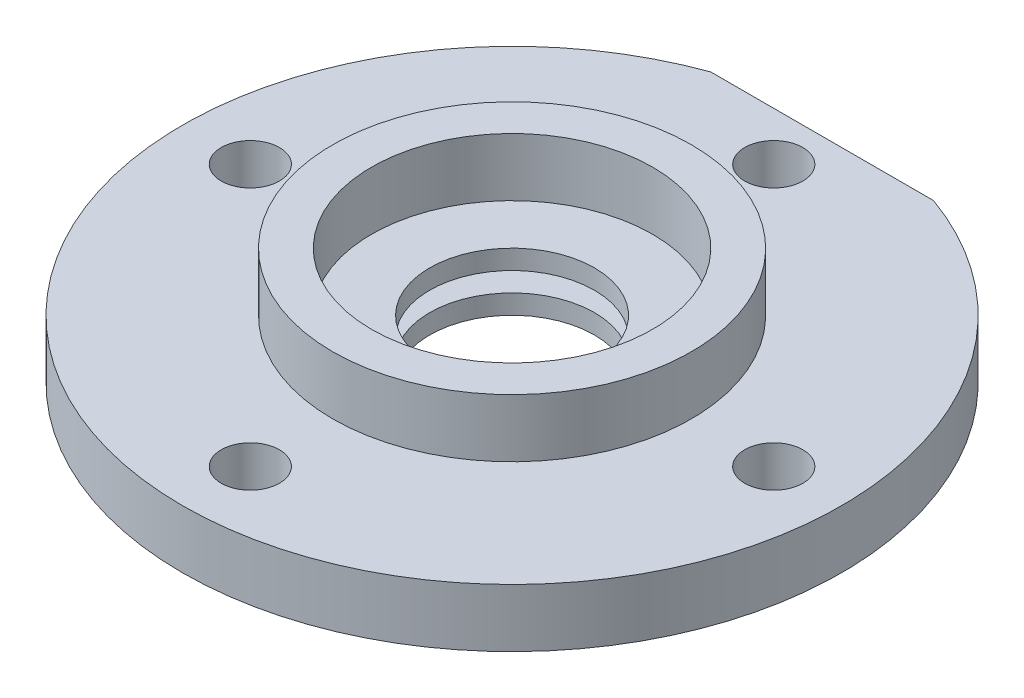
ISO-10303-21;
HEADER;
FILE_DESCRIPTION(('STEP AP214'),'2;1');
FILE_NAME('part.step','',(''),(''),'','','');
FILE_SCHEMA(('AUTOMOTIVE_DESIGN { 1 0 10303 214 1 1 1 1 }'));
ENDSEC;
DATA;
#1=APPLICATION_CONTEXT('core data for automotive mechanical design processes');
#2=APPLICATION_PROTOCOL_DEFINITION('international standard','automotive_design',2000,#1);
#3=PRODUCT_CONTEXT('',#1,'mechanical');
#4=PRODUCT('Part','Part','',(#3));
#5=PRODUCT_RELATED_PRODUCT_CATEGORY('part','',(#4));
#6=PRODUCT_DEFINITION_FORMATION('','',#4);
#7=PRODUCT_DEFINITION_CONTEXT('part definition',#1,'design');
#8=PRODUCT_DEFINITION('design','',#6,#7);
#9=PRODUCT_DEFINITION_SHAPE('','',#8);
#10=(LENGTH_UNIT() NAMED_UNIT(*) SI_UNIT(.MILLI.,.METRE.));
#11=(NAMED_UNIT(*) PLANE_ANGLE_UNIT() SI_UNIT($,.RADIAN.));
#12=(NAMED_UNIT(*) SI_UNIT($,.STERADIAN.) SOLID_ANGLE_UNIT());
#13=UNCERTAINTY_MEASURE_WITH_UNIT(LENGTH_MEASURE(1.E-05),#10,'distance_accuracy_value','');
#14=(GEOMETRIC_REPRESENTATION_CONTEXT(3) GLOBAL_UNCERTAINTY_ASSIGNED_CONTEXT((#13)) GLOBAL_UNIT_ASSIGNED_CONTEXT((#10,
#11,#12)) REPRESENTATION_CONTEXT('',''));
#15=CARTESIAN_POINT('',(0.,0.,0.));
#16=DIRECTION('',(0.,0.,1.));
#17=DIRECTION('',(1.,0.,0.));
#18=AXIS2_PLACEMENT_3D('',#15,#16,#17);
#19=CARTESIAN_POINT('',(0.,6.,0.));
#20=DIRECTION('',(0.,1.,0.));
#21=DIRECTION('',(0.,0.,1.));
#22=AXIS2_PLACEMENT_3D('',#19,#20,#21);
#23=PLANE('',#22);
#24=CARTESIAN_POINT('',(0.,6.,0.));
#25=DIRECTION('',(0.,1.,0.));
#26=DIRECTION('',(0.,0.,1.));
#27=AXIS2_PLACEMENT_3D('',#24,#25,#26);
#28=CIRCLE('',#27,18.5);
#29=CARTESIAN_POINT('',(0.,6.,18.5));
#30=VERTEX_POINT('',#29);
#31=EDGE_CURVE('E11',#30,#30,#28,.T.);
#32=ORIENTED_EDGE('',*,*,#31,.F.);
#33=EDGE_LOOP('',(#32));
#34=FACE_BOUND('',#33,.T.);
#35=CARTESIAN_POINT('',(-1.88217497143484E-13,6.,27.));
#36=DIRECTION('',(0.,1.,0.));
#37=DIRECTION('',(0.,0.,1.));
#38=AXIS2_PLACEMENT_3D('',#35,#36,#37);
#39=CIRCLE('',#38,3.);
#40=CARTESIAN_POINT('',(-1.88217497143484E-13,6.,30.));
#41=VERTEX_POINT('',#40);
#42=EDGE_CURVE('E105',#41,#41,#39,.T.);
#43=ORIENTED_EDGE('',*,*,#42,.F.);
#44=EDGE_LOOP('',(#43));
#45=FACE_BOUND('',#44,.T.);
#46=CARTESIAN_POINT('',(0.,6.,-27.));
#47=DIRECTION('',(0.,1.,0.));
#48=DIRECTION('',(0.,0.,1.));
#49=AXIS2_PLACEMENT_3D('',#46,#47,#48);
#50=CIRCLE('',#49,3.);
#51=CARTESIAN_POINT('',(0.,6.,-24.));
#52=VERTEX_POINT('',#51);
#53=EDGE_CURVE('E86',#52,#52,#50,.T.);
#54=ORIENTED_EDGE('',*,*,#53,.F.);
#55=EDGE_LOOP('',(#54));
#56=FACE_BOUND('',#55,.T.);
#57=CARTESIAN_POINT('',(0.,6.,0.));
#58=DIRECTION('',(0.,1.,0.));
#59=DIRECTION('',(0.,0.,1.));
#60=AXIS2_PLACEMENT_3D('',#57,#58,#59);
#61=CIRCLE('',#60,34.);
#62=CARTESIAN_POINT('',(-11.4891252930761,6.,-32.));
#63=VERTEX_POINT('',#62);
#64=CARTESIAN_POINT('',(11.4891252930761,6.,-32.));
#65=VERTEX_POINT('',#64);
#66=EDGE_CURVE('E78',#63,#65,#61,.T.);
#67=ORIENTED_EDGE('',*,*,#66,.T.);
#68=DIRECTION('',(-1.,0.,0.));
#69=VECTOR('',#68,1.);
#70=CARTESIAN_POINT('',(-11.4891252930761,6.,-32.));
#71=LINE('',#70,#69);
#72=EDGE_CURVE('E60',#65,#63,#71,.T.);
#73=ORIENTED_EDGE('',*,*,#72,.T.);
#74=EDGE_LOOP('',(#67,#73));
#75=FACE_BOUND('',#74,.T.);
#76=CARTESIAN_POINT('',(27.,6.,0.));
#77=DIRECTION('',(0.,1.,0.));
#78=DIRECTION('',(0.,0.,1.));
#79=AXIS2_PLACEMENT_3D('',#76,#77,#78);
#80=CIRCLE('',#79,3.);
#81=CARTESIAN_POINT('',(27.,6.,3.00000000000009));
#82=VERTEX_POINT('',#81);
#83=EDGE_CURVE('E99',#82,#82,#80,.T.);
#84=ORIENTED_EDGE('',*,*,#83,.F.);
#85=EDGE_LOOP('',(#84));
#86=FACE_BOUND('',#85,.T.);
#87=CARTESIAN_POINT('',(-27.,6.,-2.8275992658422E-13));
#88=DIRECTION('',(0.,1.,0.));
#89=DIRECTION('',(0.,0.,1.));
#90=AXIS2_PLACEMENT_3D('',#87,#88,#89);
#91=CIRCLE('',#90,3.);
#92=CARTESIAN_POINT('',(-27.,6.,2.99999999999972));
#93=VERTEX_POINT('',#92);
#94=EDGE_CURVE('E113',#93,#93,#91,.T.);
#95=ORIENTED_EDGE('',*,*,#94,.F.);
#96=EDGE_LOOP('',(#95));
#97=FACE_BOUND('',#96,.T.);
#98=ADVANCED_FACE('F42',(#34,#45,#56,#75,#86,#97),#23,.T.);
#99=CARTESIAN_POINT('',(0.,0.,0.));
#100=DIRECTION('',(0.,1.,0.));
#101=DIRECTION('',(0.,0.,1.));
#102=AXIS2_PLACEMENT_3D('',#99,#100,#101);
#103=PLANE('',#102);
#104=CARTESIAN_POINT('',(0.,0.,0.));
#105=DIRECTION('',(0.,-1.,0.));
#106=DIRECTION('',(0.,0.,-1.));
#107=AXIS2_PLACEMENT_3D('',#104,#105,#106);
#108=CIRCLE('',#107,8.5);
#109=CARTESIAN_POINT('',(0.,0.,-8.5));
#110=VERTEX_POINT('',#109);
#111=EDGE_CURVE('E156',#110,#110,#108,.T.);
#112=ORIENTED_EDGE('',*,*,#111,.F.);
#113=EDGE_LOOP('',(#112));
#114=FACE_BOUND('',#113,.T.);
#115=CARTESIAN_POINT('',(0.,0.,0.));
#116=DIRECTION('',(0.,1.,0.));
#117=DIRECTION('',(0.,0.,1.));
#118=AXIS2_PLACEMENT_3D('',#115,#116,#117);
#119=CIRCLE('',#118,34.);
#120=CARTESIAN_POINT('',(-11.4891252930761,0.,-32.));
#121=VERTEX_POINT('',#120);
#122=CARTESIAN_POINT('',(11.4891252930761,0.,-32.));
#123=VERTEX_POINT('',#122);
#124=EDGE_CURVE('E79',#121,#123,#119,.T.);
#125=ORIENTED_EDGE('',*,*,#124,.F.);
#126=DIRECTION('',(-1.,0.,0.));
#127=VECTOR('',#126,1.);
#128=CARTESIAN_POINT('',(-11.4891252930761,0.,-32.));
#129=LINE('',#128,#127);
#130=EDGE_CURVE('E68',#123,#121,#129,.T.);
#131=ORIENTED_EDGE('',*,*,#130,.F.);
#132=EDGE_LOOP('',(#125,#131));
#133=FACE_BOUND('',#132,.T.);
#134=CARTESIAN_POINT('',(0.,0.,-27.));
#135=DIRECTION('',(0.,1.,0.));
#136=DIRECTION('',(0.,0.,1.));
#137=AXIS2_PLACEMENT_3D('',#134,#135,#136);
#138=CIRCLE('',#137,3.);
#139=CARTESIAN_POINT('',(0.,0.,-24.));
#140=VERTEX_POINT('',#139);
#141=EDGE_CURVE('E90',#140,#140,#138,.T.);
#142=ORIENTED_EDGE('',*,*,#141,.T.);
#143=EDGE_LOOP('',(#142));
#144=FACE_BOUND('',#143,.T.);
#145=CARTESIAN_POINT('',(27.,0.,0.));
#146=DIRECTION('',(0.,1.,0.));
#147=DIRECTION('',(0.,0.,1.));
#148=AXIS2_PLACEMENT_3D('',#145,#146,#147);
#149=CIRCLE('',#148,3.);
#150=CARTESIAN_POINT('',(27.,0.,3.00000000000009));
#151=VERTEX_POINT('',#150);
#152=EDGE_CURVE('E101',#151,#151,#149,.T.);
#153=ORIENTED_EDGE('',*,*,#152,.T.);
#154=EDGE_LOOP('',(#153));
#155=FACE_BOUND('',#154,.T.);
#156=CARTESIAN_POINT('',(-1.88217497143484E-13,0.,27.));
#157=DIRECTION('',(0.,1.,0.));
#158=DIRECTION('',(0.,0.,1.));
#159=AXIS2_PLACEMENT_3D('',#156,#157,#158);
#160=CIRCLE('',#159,3.);
#161=CARTESIAN_POINT('',(-1.88217497143484E-13,0.,30.));
#162=VERTEX_POINT('',#161);
#163=EDGE_CURVE('E109',#162,#162,#160,.T.);
#164=ORIENTED_EDGE('',*,*,#163,.T.);
#165=EDGE_LOOP('',(#164));
#166=FACE_BOUND('',#165,.T.);
#167=CARTESIAN_POINT('',(-27.,0.,-2.8275992658422E-13));
#168=DIRECTION('',(0.,1.,0.));
#169=DIRECTION('',(0.,0.,1.));
#170=AXIS2_PLACEMENT_3D('',#167,#168,#169);
#171=CIRCLE('',#170,3.);
#172=CARTESIAN_POINT('',(-27.,0.,2.99999999999972));
#173=VERTEX_POINT('',#172);
#174=EDGE_CURVE('E117',#173,#173,#171,.T.);
#175=ORIENTED_EDGE('',*,*,#174,.T.);
#176=EDGE_LOOP('',(#175));
#177=FACE_BOUND('',#176,.T.);
#178=ADVANCED_FACE('F83',(#114,#133,#144,#155,#166,#177),#103,.F.);
#179=CARTESIAN_POINT('',(0.,6.,0.));
#180=DIRECTION('',(0.,-1.,0.));
#181=DIRECTION('',(0.,0.,-1.));
#182=AXIS2_PLACEMENT_3D('',#179,#180,#181);
#183=CYLINDRICAL_SURFACE('',#182,34.);
#184=ORIENTED_EDGE('',*,*,#124,.T.);
#185=DIRECTION('',(0.,-1.,0.));
#186=VECTOR('',#185,1.);
#187=CARTESIAN_POINT('',(11.4891252930761,6.,-32.));
#188=LINE('',#187,#186);
#189=EDGE_CURVE('E46',#65,#123,#188,.T.);
#190=ORIENTED_EDGE('',*,*,#189,.F.);
#191=ORIENTED_EDGE('',*,*,#66,.F.);
#192=DIRECTION('',(0.,-1.,0.));
#193=VECTOR('',#192,1.);
#194=CARTESIAN_POINT('',(-11.4891252930761,6.,-32.));
#195=LINE('',#194,#193);
#196=EDGE_CURVE('E73',#63,#121,#195,.T.);
#197=ORIENTED_EDGE('',*,*,#196,.T.);
#198=EDGE_LOOP('',(#184,#190,#191,#197));
#199=FACE_BOUND('',#198,.T.);
#200=ADVANCED_FACE('F44',(#199),#183,.T.);
#201=CARTESIAN_POINT('',(-11.4891252930761,6.,-32.));
#202=DIRECTION('',(0.,0.,1.));
#203=DIRECTION('',(1.,0.,0.));
#204=AXIS2_PLACEMENT_3D('',#201,#202,#203);
#205=PLANE('',#204);
#206=ORIENTED_EDGE('',*,*,#130,.T.);
#207=ORIENTED_EDGE('',*,*,#196,.F.);
#208=ORIENTED_EDGE('',*,*,#72,.F.);
#209=ORIENTED_EDGE('',*,*,#189,.T.);
#210=EDGE_LOOP('',(#206,#207,#208,#209));
#211=FACE_BOUND('',#210,.T.);
#212=ADVANCED_FACE('F72',(#211),#205,.F.);
#213=CARTESIAN_POINT('',(0.,6.,-27.));
#214=DIRECTION('',(0.,-1.,0.));
#215=DIRECTION('',(0.,0.,-1.));
#216=AXIS2_PLACEMENT_3D('',#213,#214,#215);
#217=CYLINDRICAL_SURFACE('',#216,3.);
#218=ORIENTED_EDGE('',*,*,#53,.T.);
#219=EDGE_LOOP('',(#218));
#220=FACE_BOUND('',#219,.T.);
#221=ORIENTED_EDGE('',*,*,#141,.F.);
#222=EDGE_LOOP('',(#221));
#223=FACE_BOUND('',#222,.T.);
#224=ADVANCED_FACE('F175',(#220,#223),#217,.F.);
#225=CARTESIAN_POINT('',(27.,6.,0.));
#226=DIRECTION('',(0.,-1.,0.));
#227=DIRECTION('',(0.,0.,-1.));
#228=AXIS2_PLACEMENT_3D('',#225,#226,#227);
#229=CYLINDRICAL_SURFACE('',#228,3.);
#230=ORIENTED_EDGE('',*,*,#83,.T.);
#231=EDGE_LOOP('',(#230));
#232=FACE_BOUND('',#231,.T.);
#233=ORIENTED_EDGE('',*,*,#152,.F.);
#234=EDGE_LOOP('',(#233));
#235=FACE_BOUND('',#234,.T.);
#236=ADVANCED_FACE('F179',(#232,#235),#229,.F.);
#237=CARTESIAN_POINT('',(-1.88217497143484E-13,6.,27.));
#238=DIRECTION('',(0.,-1.,0.));
#239=DIRECTION('',(0.,0.,-1.));
#240=AXIS2_PLACEMENT_3D('',#237,#238,#239);
#241=CYLINDRICAL_SURFACE('',#240,3.);
#242=ORIENTED_EDGE('',*,*,#42,.T.);
#243=EDGE_LOOP('',(#242));
#244=FACE_BOUND('',#243,.T.);
#245=ORIENTED_EDGE('',*,*,#163,.F.);
#246=EDGE_LOOP('',(#245));
#247=FACE_BOUND('',#246,.T.);
#248=ADVANCED_FACE('F184',(#244,#247),#241,.F.);
#249=CARTESIAN_POINT('',(-27.,6.,-2.8275992658422E-13));
#250=DIRECTION('',(0.,-1.,0.));
#251=DIRECTION('',(0.,0.,-1.));
#252=AXIS2_PLACEMENT_3D('',#249,#250,#251);
#253=CYLINDRICAL_SURFACE('',#252,3.);
#254=ORIENTED_EDGE('',*,*,#94,.T.);
#255=EDGE_LOOP('',(#254));
#256=FACE_BOUND('',#255,.T.);
#257=ORIENTED_EDGE('',*,*,#174,.F.);
#258=EDGE_LOOP('',(#257));
#259=FACE_BOUND('',#258,.T.);
#260=ADVANCED_FACE('F191',(#256,#259),#253,.F.);
#261=CARTESIAN_POINT('',(0.,12.,0.));
#262=DIRECTION('',(0.,-1.,0.));
#263=DIRECTION('',(0.,0.,-1.));
#264=AXIS2_PLACEMENT_3D('',#261,#262,#263);
#265=CYLINDRICAL_SURFACE('',#264,18.5);
#266=CARTESIAN_POINT('',(0.,12.,0.));
#267=DIRECTION('',(0.,1.,0.));
#268=DIRECTION('',(0.,0.,1.));
#269=AXIS2_PLACEMENT_3D('',#266,#267,#268);
#270=CIRCLE('',#269,18.5);
#271=CARTESIAN_POINT('',(0.,12.,18.5));
#272=VERTEX_POINT('',#271);
#273=EDGE_CURVE('E121',#272,#272,#270,.T.);
#274=ORIENTED_EDGE('',*,*,#273,.F.);
#275=EDGE_LOOP('',(#274));
#276=FACE_BOUND('',#275,.T.);
#277=ORIENTED_EDGE('',*,*,#31,.T.);
#278=EDGE_LOOP('',(#277));
#279=FACE_BOUND('',#278,.T.);
#280=ADVANCED_FACE('F195',(#276,#279),#265,.T.);
#281=CARTESIAN_POINT('',(0.,12.,0.));
#282=DIRECTION('',(0.,1.,0.));
#283=DIRECTION('',(0.,0.,1.));
#284=AXIS2_PLACEMENT_3D('',#281,#282,#283);
#285=PLANE('',#284);
#286=CARTESIAN_POINT('',(0.,12.,0.));
#287=DIRECTION('',(0.,-1.,0.));
#288=DIRECTION('',(0.,0.,-1.));
#289=AXIS2_PLACEMENT_3D('',#286,#287,#288);
#290=CIRCLE('',#289,14.5);
#291=CARTESIAN_POINT('',(0.,12.,-14.5));
#292=VERTEX_POINT('',#291);
#293=EDGE_CURVE('E128',#292,#292,#290,.T.);
#294=ORIENTED_EDGE('',*,*,#293,.T.);
#295=EDGE_LOOP('',(#294));
#296=FACE_BOUND('',#295,.T.);
#297=ORIENTED_EDGE('',*,*,#273,.T.);
#298=EDGE_LOOP('',(#297));
#299=FACE_BOUND('',#298,.T.);
#300=ADVANCED_FACE('F199',(#296,#299),#285,.T.);
#301=CARTESIAN_POINT('',(0.,0.,0.));
#302=DIRECTION('',(0.,-1.,0.));
#303=DIRECTION('',(0.,0.,-1.));
#304=AXIS2_PLACEMENT_3D('',#301,#302,#303);
#305=CYLINDRICAL_SURFACE('',#304,14.5);
#306=ORIENTED_EDGE('',*,*,#293,.F.);
#307=EDGE_LOOP('',(#306));
#308=FACE_BOUND('',#307,.T.);
#309=CARTESIAN_POINT('',(0.,6.00000000000001,0.));
#310=DIRECTION('',(0.,-1.,0.));
#311=DIRECTION('',(0.,0.,-1.));
#312=AXIS2_PLACEMENT_3D('',#309,#310,#311);
#313=CIRCLE('',#312,14.5);
#314=CARTESIAN_POINT('',(0.,6.00000000000001,-14.5));
#315=VERTEX_POINT('',#314);
#316=EDGE_CURVE('E132',#315,#315,#313,.T.);
#317=ORIENTED_EDGE('',*,*,#316,.T.);
#318=EDGE_LOOP('',(#317));
#319=FACE_BOUND('',#318,.T.);
#320=ADVANCED_FACE('F202',(#308,#319),#305,.F.);
#321=CARTESIAN_POINT('',(14.5,6.00000000000001,0.));
#322=DIRECTION('',(0.,-1.,0.));
#323=DIRECTION('',(0.,0.,-1.));
#324=AXIS2_PLACEMENT_3D('',#321,#322,#323);
#325=PLANE('',#324);
#326=ORIENTED_EDGE('',*,*,#316,.F.);
#327=EDGE_LOOP('',(#326));
#328=FACE_BOUND('',#327,.T.);
#329=CARTESIAN_POINT('',(0.,6.00000000000001,0.));
#330=DIRECTION('',(0.,-1.,0.));
#331=DIRECTION('',(0.,0.,-1.));
#332=AXIS2_PLACEMENT_3D('',#329,#330,#331);
#333=CIRCLE('',#332,8.5);
#334=CARTESIAN_POINT('',(0.,6.00000000000001,-8.5));
#335=VERTEX_POINT('',#334);
#336=EDGE_CURVE('E136',#335,#335,#333,.T.);
#337=ORIENTED_EDGE('',*,*,#336,.T.);
#338=EDGE_LOOP('',(#337));
#339=FACE_BOUND('',#338,.T.);
#340=ADVANCED_FACE('F206',(#328,#339),#325,.F.);
#341=CARTESIAN_POINT('',(0.,0.,0.));
#342=DIRECTION('',(0.,-1.,0.));
#343=DIRECTION('',(0.,0.,-1.));
#344=AXIS2_PLACEMENT_3D('',#341,#342,#343);
#345=CYLINDRICAL_SURFACE('',#344,8.5);
#346=ORIENTED_EDGE('',*,*,#336,.F.);
#347=EDGE_LOOP('',(#346));
#348=FACE_BOUND('',#347,.T.);
#349=CARTESIAN_POINT('',(0.,4.,0.));
#350=DIRECTION('',(0.,-1.,0.));
#351=DIRECTION('',(0.,0.,-1.));
#352=AXIS2_PLACEMENT_3D('',#349,#350,#351);
#353=CIRCLE('',#352,8.5);
#354=CARTESIAN_POINT('',(0.,4.,-8.5));
#355=VERTEX_POINT('',#354);
#356=EDGE_CURVE('E140',#355,#355,#353,.T.);
#357=ORIENTED_EDGE('',*,*,#356,.T.);
#358=EDGE_LOOP('',(#357));
#359=FACE_BOUND('',#358,.T.);
#360=ADVANCED_FACE('F210',(#348,#359),#345,.F.);
#361=CARTESIAN_POINT('',(8.5,4.,0.));
#362=DIRECTION('',(0.,1.,0.));
#363=DIRECTION('',(0.,0.,1.));
#364=AXIS2_PLACEMENT_3D('',#361,#362,#363);
#365=PLANE('',#364);
#366=ORIENTED_EDGE('',*,*,#356,.F.);
#367=EDGE_LOOP('',(#366));
#368=FACE_BOUND('',#367,.T.);
#369=CARTESIAN_POINT('',(0.,4.,0.));
#370=DIRECTION('',(0.,-1.,0.));
#371=DIRECTION('',(0.,0.,-1.));
#372=AXIS2_PLACEMENT_3D('',#369,#370,#371);
#373=CIRCLE('',#372,12.5);
#374=CARTESIAN_POINT('',(0.,4.,-12.5));
#375=VERTEX_POINT('',#374);
#376=EDGE_CURVE('E144',#375,#375,#373,.T.);
#377=ORIENTED_EDGE('',*,*,#376,.T.);
#378=EDGE_LOOP('',(#377));
#379=FACE_BOUND('',#378,.T.);
#380=ADVANCED_FACE('F214',(#368,#379),#365,.F.);
#381=CARTESIAN_POINT('',(0.,0.,0.));
#382=DIRECTION('',(0.,-1.,0.));
#383=DIRECTION('',(0.,0.,-1.));
#384=AXIS2_PLACEMENT_3D('',#381,#382,#383);
#385=CYLINDRICAL_SURFACE('',#384,12.5);
#386=ORIENTED_EDGE('',*,*,#376,.F.);
#387=EDGE_LOOP('',(#386));
#388=FACE_BOUND('',#387,.T.);
#389=CARTESIAN_POINT('',(0.,2.,0.));
#390=DIRECTION('',(0.,-1.,0.));
#391=DIRECTION('',(0.,0.,-1.));
#392=AXIS2_PLACEMENT_3D('',#389,#390,#391);
#393=CIRCLE('',#392,12.5);
#394=CARTESIAN_POINT('',(0.,2.,-12.5));
#395=VERTEX_POINT('',#394);
#396=EDGE_CURVE('E148',#395,#395,#393,.T.);
#397=ORIENTED_EDGE('',*,*,#396,.T.);
#398=EDGE_LOOP('',(#397));
#399=FACE_BOUND('',#398,.T.);
#400=ADVANCED_FACE('F218',(#388,#399),#385,.F.);
#401=CARTESIAN_POINT('',(12.5,2.,0.));
#402=DIRECTION('',(0.,-1.,0.));
#403=DIRECTION('',(0.,0.,-1.));
#404=AXIS2_PLACEMENT_3D('',#401,#402,#403);
#405=PLANE('',#404);
#406=ORIENTED_EDGE('',*,*,#396,.F.);
#407=EDGE_LOOP('',(#406));
#408=FACE_BOUND('',#407,.T.);
#409=CARTESIAN_POINT('',(0.,2.,0.));
#410=DIRECTION('',(0.,-1.,0.));
#411=DIRECTION('',(0.,0.,-1.));
#412=AXIS2_PLACEMENT_3D('',#409,#410,#411);
#413=CIRCLE('',#412,8.5);
#414=CARTESIAN_POINT('',(0.,2.,-8.5));
#415=VERTEX_POINT('',#414);
#416=EDGE_CURVE('E152',#415,#415,#413,.T.);
#417=ORIENTED_EDGE('',*,*,#416,.T.);
#418=EDGE_LOOP('',(#417));
#419=FACE_BOUND('',#418,.T.);
#420=ADVANCED_FACE('F222',(#408,#419),#405,.F.);
#421=CARTESIAN_POINT('',(0.,0.,0.));
#422=DIRECTION('',(0.,-1.,0.));
#423=DIRECTION('',(0.,0.,-1.));
#424=AXIS2_PLACEMENT_3D('',#421,#422,#423);
#425=CYLINDRICAL_SURFACE('',#424,8.5);
#426=ORIENTED_EDGE('',*,*,#416,.F.);
#427=EDGE_LOOP('',(#426));
#428=FACE_BOUND('',#427,.T.);
#429=ORIENTED_EDGE('',*,*,#111,.T.);
#430=EDGE_LOOP('',(#429));
#431=FACE_BOUND('',#430,.T.);
#432=ADVANCED_FACE('F161',(#428,#431),#425,.F.);
#433=CLOSED_SHELL('',(#98,#178,#200,#212,#224,#236,#248,#260,#280,#300,#320,#340,#360,#380,#400,
#420,#432));
#434=MANIFOLD_SOLID_BREP('B2',#433);
#435=ADVANCED_BREP_SHAPE_REPRESENTATION('',(#18,#434),#14);
#436=SHAPE_DEFINITION_REPRESENTATION(#9,#435);
ENDSEC;
END-ISO-10303-21;
